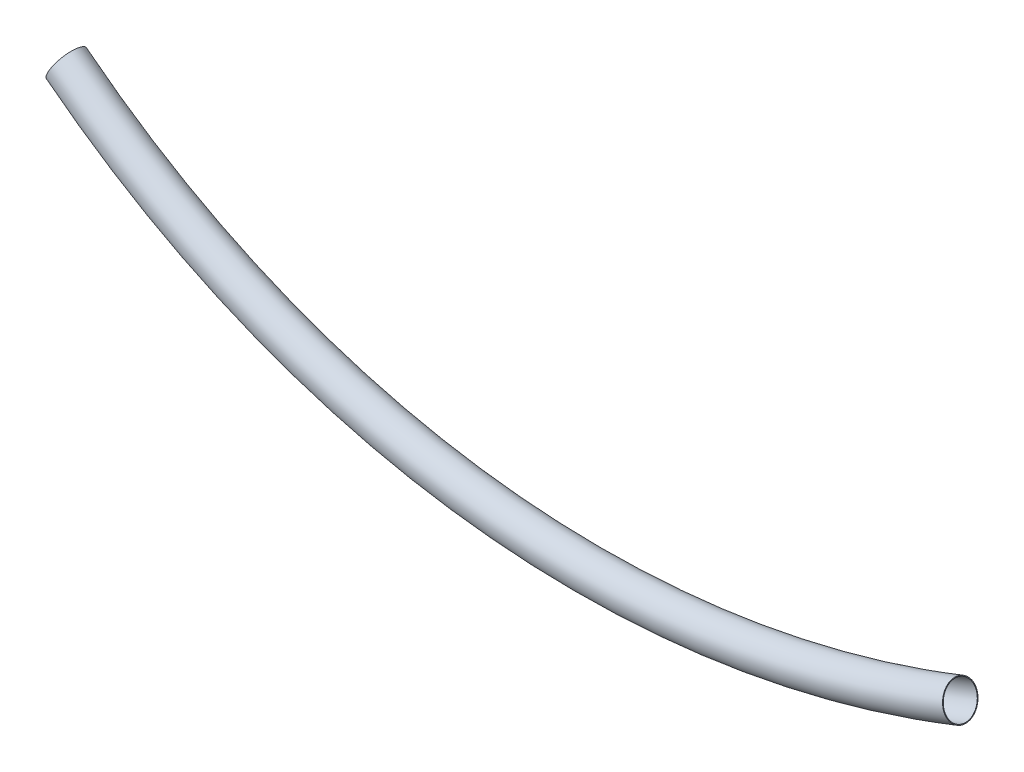
ISO-10303-21;
HEADER;
FILE_DESCRIPTION(('STEP AP214'),'2;1');
FILE_NAME('part.step','',(''),(''),'','','');
FILE_SCHEMA(('AUTOMOTIVE_DESIGN { 1 0 10303 214 1 1 1 1 }'));
ENDSEC;
DATA;
#1=APPLICATION_CONTEXT('core data for automotive mechanical design processes');
#2=APPLICATION_PROTOCOL_DEFINITION('international standard','automotive_design',2000,#1);
#3=PRODUCT_CONTEXT('',#1,'mechanical');
#4=PRODUCT('Part','Part','',(#3));
#5=PRODUCT_RELATED_PRODUCT_CATEGORY('part','',(#4));
#6=PRODUCT_DEFINITION_FORMATION('','',#4);
#7=PRODUCT_DEFINITION_CONTEXT('part definition',#1,'design');
#8=PRODUCT_DEFINITION('design','',#6,#7);
#9=PRODUCT_DEFINITION_SHAPE('','',#8);
#10=(LENGTH_UNIT() NAMED_UNIT(*) SI_UNIT(.MILLI.,.METRE.));
#11=(NAMED_UNIT(*) PLANE_ANGLE_UNIT() SI_UNIT($,.RADIAN.));
#12=(NAMED_UNIT(*) SI_UNIT($,.STERADIAN.) SOLID_ANGLE_UNIT());
#13=UNCERTAINTY_MEASURE_WITH_UNIT(LENGTH_MEASURE(1.E-05),#10,'distance_accuracy_value','');
#14=(GEOMETRIC_REPRESENTATION_CONTEXT(3) GLOBAL_UNCERTAINTY_ASSIGNED_CONTEXT((#13)) GLOBAL_UNIT_ASSIGNED_CONTEXT((#10,
#11,#12)) REPRESENTATION_CONTEXT('',''));
#15=CARTESIAN_POINT('',(0.,0.,0.));
#16=DIRECTION('',(0.,0.,1.));
#17=DIRECTION('',(1.,0.,0.));
#18=AXIS2_PLACEMENT_3D('',#15,#16,#17);
#19=CARTESIAN_POINT('',(5240.59258807553,-3970.66979282709,3800.09437515866));
#20=DIRECTION('',(-0.941114351142538,-0.331446569951202,0.0666854507455971));
#21=DIRECTION('',(0.332186000076311,-0.943213900106069,0.));
#22=AXIS2_PLACEMENT_3D('',#19,#20,#21);
#23=PLANE('',#22);
#24=CARTESIAN_POINT('',(5240.59258807553,-3970.66979282709,3800.09437515866));
#25=DIRECTION('',(-0.941114351142538,-0.331446569951202,0.0666854507455971));
#26=DIRECTION('',(0.332186000076311,-0.943213900106069,0.));
#27=AXIS2_PLACEMENT_3D('',#24,#25,#26);
#28=CIRCLE('',#27,80.7338999999999);
#29=CARTESIAN_POINT('',(5267.41125938709,-4046.81912951686,3800.09437515866));
#30=VERTEX_POINT('',#29);
#31=EDGE_CURVE('E55',#30,#30,#28,.T.);
#32=ORIENTED_EDGE('',*,*,#31,.T.);
#33=EDGE_LOOP('',(#32));
#34=FACE_BOUND('',#33,.T.);
#35=CARTESIAN_POINT('',(5240.59258807553,-3970.66979282709,3800.09437515866));
#36=DIRECTION('',(-0.941114351142538,-0.331446569951202,0.0666854507455971));
#37=DIRECTION('',(0.332186000076311,-0.943213900106069,0.));
#38=AXIS2_PLACEMENT_3D('',#35,#36,#37);
#39=CIRCLE('',#38,84.1375000000002);
#40=CARTESIAN_POINT('',(5268.54188765695,-4050.02945234726,3800.09437515866));
#41=VERTEX_POINT('',#40);
#42=EDGE_CURVE('E42',#41,#41,#39,.T.);
#43=ORIENTED_EDGE('',*,*,#42,.F.);
#44=EDGE_LOOP('',(#43));
#45=FACE_BOUND('',#44,.T.);
#46=ADVANCED_FACE('F39',(#34,#45),#23,.F.);
#47=CARTESIAN_POINT('',(3629.59201644663,474.860955787558,3160.07711591139));
#48=DIRECTION('',(0.0176715528555319,0.148748255784951,0.988717185357172));
#49=DIRECTION('',(0.,-0.98887160169456,0.148771487059972));
#50=AXIS2_PLACEMENT_3D('',#47,#48,#49);
#51=TOROIDAL_SURFACE('',#50,4771.54991284816,80.7338999999999);
#52=ORIENTED_EDGE('',*,*,#31,.F.);
#53=EDGE_LOOP('',(#52));
#54=FACE_BOUND('',#53,.T.);
#55=CARTESIAN_POINT('',(1004.01530185701,-3538.2294666105,3757.1026156186));
#56=CARTESIAN_POINT('',(1004.343077654,-3537.69711182915,3756.14950561159));
#57=CARTESIAN_POINT('',(1004.67934525389,-3537.1464417076,3755.20958507052));
#58=CARTESIAN_POINT('',(1005.36829896926,-3536.00940285016,3753.35764651678));
#59=CARTESIAN_POINT('',(1005.72098628294,-3535.42303150808,3752.44563054847));
#60=CARTESIAN_POINT('',(1006.44217972551,-3534.21559002067,3750.6510287914));
#61=CARTESIAN_POINT('',(1006.81068889177,-3533.59451320582,3749.76844871187));
#62=CARTESIAN_POINT('',(1007.56283139089,-3532.31883278213,3748.03437182661));
#63=CARTESIAN_POINT('',(1007.94646613166,-3531.66422605057,3747.1828779287));
#64=CARTESIAN_POINT('',(1008.72855068499,-3530.32201235509,3745.51166662036));
#65=CARTESIAN_POINT('',(1009.12701586778,-3529.63437092672,3744.69198408322));
#66=CARTESIAN_POINT('',(1009.93769319922,-3528.22791579532,3743.08672082576));
#67=CARTESIAN_POINT('',(1010.34990663814,-3527.50909916459,3742.30114332219));
#68=CARTESIAN_POINT('',(1011.18723313383,-3526.04177476453,3740.76567538105));
#69=CARTESIAN_POINT('',(1011.61234406366,-3525.29327188463,3740.01577911104));
#70=CARTESIAN_POINT('',(1012.47480627089,-3523.76774269408,3738.55277867976));
#71=CARTESIAN_POINT('',(1012.91215869113,-3522.99071371819,3737.83967797143));
#72=CARTESIAN_POINT('',(1013.79794493585,-3521.41019648336,3736.45211566227));
#73=CARTESIAN_POINT('',(1014.24637009471,-3520.60672876144,3735.77762513593));
#74=CARTESIAN_POINT('',(1015.15386203282,-3518.97413809305,3734.46781007152));
#75=CARTESIAN_POINT('',(1015.61292980184,-3518.14501275794,3733.83248919657));
#76=CARTESIAN_POINT('',(1016.54081282371,-3516.46272399888,3732.60223219029));
#77=CARTESIAN_POINT('',(1017.0096273156,-3515.60956244969,3732.00729292155));
#78=CARTESIAN_POINT('',(1017.95624545314,-3513.88058571572,3730.85872442713));
#79=CARTESIAN_POINT('',(1018.43404993261,-3513.00476842679,3730.30509905717));
#80=CARTESIAN_POINT('',(1019.39759831418,-3511.23240633174,3729.24035827553));
#81=CARTESIAN_POINT('',(1019.88333934552,-3510.33586897378,3728.729227883));
#82=CARTESIAN_POINT('',(1020.86206700741,-3508.52335707953,3727.75012556265));
#83=CARTESIAN_POINT('',(1021.35505430614,-3507.60738074731,3727.28215764409));
#84=CARTESIAN_POINT('',(1022.8434902138,-3504.83288188159,3725.94435615922));
#85=CARTESIAN_POINT('',(1023.84867214078,-3502.94731249595,3725.14033842159));
#86=CARTESIAN_POINT('',(1025.88079248616,-3499.11187983032,3723.7115531316));
#87=CARTESIAN_POINT('',(1026.90779417913,-3497.16181656027,3723.08741579423));
#88=CARTESIAN_POINT('',(1028.97305843265,-3493.21714404636,3722.02628636778));
#89=CARTESIAN_POINT('',(1030.01132102882,-3491.22253466156,3721.58929487091));
#90=CARTESIAN_POINT('',(1032.09176933977,-3487.20286786604,3720.90553396437));
#91=CARTESIAN_POINT('',(1033.13395526977,-3485.17780876617,3720.65877514756));
#92=CARTESIAN_POINT('',(1035.21483098099,-3481.11165692068,3720.35725226053));
#93=CARTESIAN_POINT('',(1036.25352075952,-3479.07056416269,3720.30248833855));
#94=CARTESIAN_POINT('',(1038.32236744442,-3474.98221114106,3720.38548332439));
#95=CARTESIAN_POINT('',(1039.35250000193,-3472.93494730891,3720.52367410158));
#96=CARTESIAN_POINT('',(1041.3945329175,-3468.85338791738,3720.99245364231));
#97=CARTESIAN_POINT('',(1042.40643323888,-3466.81909238409,3721.32304279292));
#98=CARTESIAN_POINT('',(1044.40477916747,-3462.77797361319,3722.17439275403));
#99=CARTESIAN_POINT('',(1045.39122478219,-3460.77115036747,3722.69515350841));
#100=CARTESIAN_POINT('',(1047.33159960363,-3456.79932141123,3723.92329504762));
#101=CARTESIAN_POINT('',(1048.28552886414,-3454.83431563152,3724.63067552372));
#102=CARTESIAN_POINT('',(1050.15291567033,-3450.96249762921,3726.22625085877));
#103=CARTESIAN_POINT('',(1051.06641961471,-3449.05561951585,3727.11423151343));
#104=CARTESIAN_POINT('',(1052.8475744441,-3445.31133641602,3729.06538784699));
#105=CARTESIAN_POINT('',(1053.71522533365,-3443.47393142266,3730.12856350853));
#106=CARTESIAN_POINT('',(1055.39838248128,-3439.88188245486,3732.42269886984));
#107=CARTESIAN_POINT('',(1056.21388953044,-3438.127237225,3733.65365602334));
#108=CARTESIAN_POINT('',(1057.78683953074,-3434.71340476927,3736.27474876812));
#109=CARTESIAN_POINT('',(1058.54428267978,-3433.05421721805,3737.66488381683));
#110=CARTESIAN_POINT('',(1059.99251856201,-3429.85013112161,3740.58838480294));
#111=CARTESIAN_POINT('',(1060.68357767375,-3428.30478215004,3742.12112514167));
#112=CARTESIAN_POINT('',(1061.99758620979,-3425.33195177431,3745.32395931452));
#113=CARTESIAN_POINT('',(1062.62053579051,-3423.90447009944,3746.99405283318));
#114=CARTESIAN_POINT('',(1063.79374508358,-3421.1778188491,3750.459740413));
#115=CARTESIAN_POINT('',(1064.34400634742,-3419.87864653506,3752.25533179422));
#116=CARTESIAN_POINT('',(1065.36779827708,-3417.41810196019,3755.95926711061));
#117=CARTESIAN_POINT('',(1065.84132922039,-3416.25672920103,3757.86761063801));
#118=CARTESIAN_POINT('',(1066.70582288995,-3414.08618068365,3761.77285687196));
#119=CARTESIAN_POINT('',(1067.09721608042,-3413.07621980508,3763.76922796007));
#120=CARTESIAN_POINT('',(1067.79775111316,-3411.20843395488,3767.84580964709));
#121=CARTESIAN_POINT('',(1068.10689324488,-3410.35060844791,3769.92601995094));
#122=CARTESIAN_POINT('',(1068.64064102983,-3408.79337643418,3774.15538768955));
#123=CARTESIAN_POINT('',(1068.86524851147,-3408.09396650118,3776.30454363199));
#124=CARTESIAN_POINT('',(1069.228276506,-3406.85865170874,3780.65645733212));
#125=CARTESIAN_POINT('',(1069.36669720227,-3406.32274650142,3782.85921497574));
#126=CARTESIAN_POINT('',(1069.555939312,-3405.42020486703,3787.29337970853));
#127=CARTESIAN_POINT('',(1069.60711871279,-3405.05288124009,3789.52463168107));
#128=CARTESIAN_POINT('',(1069.62261253403,-3404.48689881779,3794.00872003126));
#129=CARTESIAN_POINT('',(1069.58692722579,-3404.28823949563,3796.26155634147));
#130=CARTESIAN_POINT('',(1069.42895993203,-3404.06097621656,3800.77273867538));
#131=CARTESIAN_POINT('',(1069.30667881318,-3404.03237055773,3803.03108464371));
#132=CARTESIAN_POINT('',(1068.97642484174,-3404.14534812328,3807.53722808135));
#133=CARTESIAN_POINT('',(1068.76845196241,-3404.28693140078,3809.78502554736));
#134=CARTESIAN_POINT('',(1068.2685855031,-3404.73895940858,3814.25195004325));
#135=CARTESIAN_POINT('',(1067.97677236189,-3405.04924253682,3816.47110243364));
#136=CARTESIAN_POINT('',(1067.31128434192,-3405.83622580662,3820.86721581141));
#137=CARTESIAN_POINT('',(1066.93760956799,-3406.31292573509,3823.0441768528));
#138=CARTESIAN_POINT('',(1066.11112102568,-3407.4292075331,3827.34056159674));
#139=CARTESIAN_POINT('',(1065.65830685593,-3408.06879022875,3829.45998500741));
#140=CARTESIAN_POINT('',(1064.67682734938,-3409.50613561984,3833.62639143803));
#141=CARTESIAN_POINT('',(1064.14816182167,-3410.30389871341,3835.67337427563));
#142=CARTESIAN_POINT('',(1063.0173145599,-3412.05408404683,3839.68583659275));
#143=CARTESIAN_POINT('',(1062.41494350338,-3413.00690673846,3841.6510880402));
#144=CARTESIAN_POINT('',(1061.14213986632,-3415.05878390305,3845.48061007403));
#145=CARTESIAN_POINT('',(1060.47170720919,-3416.15783854054,3847.3448805468));
#146=CARTESIAN_POINT('',(1059.06758213115,-3418.49426034761,3850.95948719219));
#147=CARTESIAN_POINT('',(1058.33388859247,-3419.73162996121,3852.70982135071));
#148=CARTESIAN_POINT('',(1056.80848987191,-3422.33578835227,3856.08439066546));
#149=CARTESIAN_POINT('',(1056.01678448507,-3423.70257758695,3857.70862537616));
#150=CARTESIAN_POINT('',(1054.37690046026,-3426.56295349086,3860.82755386324));
#151=CARTESIAN_POINT('',(1053.5284598171,-3428.05713865319,3862.3215610352));
#152=CARTESIAN_POINT('',(1051.78471585659,-3431.15568924477,3865.16053211989));
#153=CARTESIAN_POINT('',(1050.88941239963,-3432.76005500226,3866.50549558858));
#154=CARTESIAN_POINT('',(1049.05827785139,-3436.06758462668,3869.03711284367));
#155=CARTESIAN_POINT('',(1048.12244586602,-3437.77075067352,3870.22376313519));
#156=CARTESIAN_POINT('',(1046.21688511984,-3441.26378912671,3872.43054638668));
#157=CARTESIAN_POINT('',(1045.24715625751,-3443.05366179274,3873.45067884789));
#158=CARTESIAN_POINT('',(1043.27561022729,-3446.71681729039,3875.32217406902));
#159=CARTESIAN_POINT('',(1042.27365464385,-3448.59047892358,3876.17264966795));
#160=CARTESIAN_POINT('',(1040.24949917661,-3452.39934917718,3877.69238962617));
#161=CARTESIAN_POINT('',(1039.2272992223,-3454.334558012,3878.36165335409));
#162=CARTESIAN_POINT('',(1037.16986960493,-3458.25285459106,3879.51432598915));
#163=CARTESIAN_POINT('',(1036.13463971388,-3460.23594317359,3879.9977316397));
#164=CARTESIAN_POINT('',(1034.05848190918,-3464.23595107653,3880.77529451697));
#165=CARTESIAN_POINT('',(1033.01755398889,-3466.25287043638,3881.0694515231));
#166=CARTESIAN_POINT('',(1030.93426323998,-3470.31231429425,3881.46702194633));
#167=CARTESIAN_POINT('',(1029.89190531227,-3472.35489699292,3881.5698670449));
#168=CARTESIAN_POINT('',(1027.81625899057,-3476.44525892123,3881.58230599899));
#169=CARTESIAN_POINT('',(1026.78297061895,-3478.49303816365,3881.49189937838));
#170=CARTESIAN_POINT('',(1024.73281543495,-3482.5792340784,3881.1183843366));
#171=CARTESIAN_POINT('',(1023.71594867949,-3484.61765071825,3880.83527524755));
#172=CARTESIAN_POINT('',(1021.70589506432,-3488.67058765506,3880.07823934376));
#173=CARTESIAN_POINT('',(1020.71270817648,-3490.6851079804,3879.60431275562));
#174=CARTESIAN_POINT('',(1018.75753013665,-3494.67502339178,3878.46909609363));
#175=CARTESIAN_POINT('',(1017.79552604819,-3496.65043456672,3877.80788485457));
#176=CARTESIAN_POINT('',(1015.9091778469,-3500.54885719916,3876.30254690501));
#177=CARTESIAN_POINT('',(1014.98483374893,-3502.47186863599,3875.45842012237));
#178=CARTESIAN_POINT('',(1013.18047368351,-3506.25164926153,3873.59308980642));
#179=CARTESIAN_POINT('',(1012.30045735465,-3508.10841899032,3872.57188771719));
#180=CARTESIAN_POINT('',(1010.59111652887,-3511.74232299817,3870.35950889052));
#181=CARTESIAN_POINT('',(1009.76179187833,-3513.51945751856,3869.16833266822));
#182=CARTESIAN_POINT('',(1008.16271405887,-3516.97504934508,3866.62887545379));
#183=CARTESIAN_POINT('',(1007.39275968841,-3518.65383483848,3865.28116773314));
#184=CARTESIAN_POINT('',(1005.91476117451,-3521.90739423178,3862.43470964068));
#185=CARTESIAN_POINT('',(1005.20671691848,-3523.48216832085,3860.93595954361));
#186=CARTESIAN_POINT('',(1003.85771717146,-3526.51623147107,3857.79800780646));
#187=CARTESIAN_POINT('',(1003.21676047366,-3527.97552260949,3856.15880869383));
#188=CARTESIAN_POINT('',(1002.0066225417,-3530.76799534405,3852.75156062112));
#189=CARTESIAN_POINT('',(1001.43744105259,-3532.10117738814,3850.98351211877));
#190=CARTESIAN_POINT('',(1000.37773912171,-3534.6252468598,3847.3404322612));
#191=CARTESIAN_POINT('',(999.886834668117,-3535.81682115333,3845.46598846709));
#192=CARTESIAN_POINT('',(998.983819474675,-3538.05679026865,3841.61533810337));
#193=CARTESIAN_POINT('',(998.571708497493,-3539.10518552172,3839.6391318403));
#194=CARTESIAN_POINT('',(997.829330268591,-3541.05109125025,3835.59913168007));
#195=CARTESIAN_POINT('',(997.499058074025,-3541.94861083714,3833.53534308147));
#196=CARTESIAN_POINT('',(996.922763013274,-3543.58626083897,3829.33493501255));
#197=CARTESIAN_POINT('',(996.676739850453,-3544.32639180806,3827.19831579869));
#198=CARTESIAN_POINT('',(996.271665766052,-3545.64094263382,3822.87698591157));
#199=CARTESIAN_POINT('',(996.112226416913,-3546.21609702035,3820.69253653366));
#200=CARTESIAN_POINT('',(995.937915610238,-3546.95463994712,3817.3852904291));
#201=CARTESIAN_POINT('',(995.890618033667,-3547.18014492444,3816.27762774635));
#202=CARTESIAN_POINT('',(995.817710511083,-3547.58939980612,3814.05393559295));
#203=CARTESIAN_POINT('',(995.792098534505,-3547.77315361874,3812.93790691555));
#204=CARTESIAN_POINT('',(995.762605840485,-3548.09862862752,3810.69908681091));
#205=CARTESIAN_POINT('',(995.75873247506,-3548.24033558804,3809.57629322429));
#206=CARTESIAN_POINT('',(995.772740160045,-3548.4813774871,3807.32640338716));
#207=CARTESIAN_POINT('',(995.790619167849,-3548.58071640293,3806.19930755054));
#208=CARTESIAN_POINT('',(995.848097707582,-3548.73687084879,3803.94264035716));
#209=CARTESIAN_POINT('',(995.887698919884,-3548.79368308826,3802.8130688156));
#210=CARTESIAN_POINT('',(995.988544784618,-3548.86467248028,3800.55365827417));
#211=CARTESIAN_POINT('',(996.049787403719,-3548.87885363706,3799.42381930939));
#212=CARTESIAN_POINT('',(996.19370741304,-3548.86458371594,3797.16729502983));
#213=CARTESIAN_POINT('',(996.276356023141,-3548.83618963635,3796.04060751821));
#214=CARTESIAN_POINT('',(996.462966181683,-3548.7369384792,3793.79098023662));
#215=CARTESIAN_POINT('',(996.566925733037,-3548.66608537936,3792.66804012548));
#216=CARTESIAN_POINT('',(996.795990055702,-3548.48204247801,3790.42761888815));
#217=CARTESIAN_POINT('',(996.92109818205,-3548.36884595562,3789.3101386571));
#218=CARTESIAN_POINT('',(997.192206360069,-3548.10034478311,3787.0829046986));
#219=CARTESIAN_POINT('',(997.338204462741,-3547.94504406002,3785.97315026047));
#220=CARTESIAN_POINT('',(997.650674506741,-3547.59280133165,3783.76436058799));
#221=CARTESIAN_POINT('',(997.817125346679,-3547.39590209572,3782.66531554771));
#222=CARTESIAN_POINT('',(998.170298817048,-3546.96075397459,3780.47883804794));
#223=CARTESIAN_POINT('',(998.357019579313,-3546.72250889879,3779.39140452841));
#224=CARTESIAN_POINT('',(998.7503711928,-3546.2051422951,3777.23015869461));
#225=CARTESIAN_POINT('',(998.956998372074,-3545.92602830099,3776.15634390942));
#226=CARTESIAN_POINT('',(999.389796405311,-3545.32743343179,3774.02411735557));
#227=CARTESIAN_POINT('',(999.615965878529,-3545.00795540786,3772.96570450487));
#228=CARTESIAN_POINT('',(1000.14271249759,-3544.2496467577,3770.61998610052));
#229=CARTESIAN_POINT('',(1000.44830690005,-3543.8003905685,3769.3371587962));
#230=CARTESIAN_POINT('',(1001.08776111237,-3542.84258726989,3766.80139828927));
#231=CARTESIAN_POINT('',(1001.42161459038,-3542.33405343288,3765.54845847017));
#232=CARTESIAN_POINT('',(1002.11673347684,-3541.25901718427,3763.07548917687));
#233=CARTESIAN_POINT('',(1002.47799880138,-3540.69251495007,3761.85545960196));
#234=CARTESIAN_POINT('',(1003.22704747436,-3539.50295230219,3759.45125712631));
#235=CARTESIAN_POINT('',(1003.6148367643,-3538.87987920603,3758.26709234576));
#236=CARTESIAN_POINT('',(1004.01530185701,-3538.2294666105,3757.1026156186));
#237=B_SPLINE_CURVE_WITH_KNOTS('',3,(#55,#56,#57,#58,#59,#60,#61,#62,#63,#64,#65,#66,#67,#68,
#69,#70,#71,#72,#73,#74,#75,#76,#77,#78,#79,#80,#81,#82,#83,#84,#85,#86,#87,#88,#89,#90,#91,#92,
#93,#94,#95,#96,#97,#98,#99,#100,#101,#102,#103,#104,#105,#106,#107,#108,#109,#110,#111,#112,
#113,#114,#115,#116,#117,#118,#119,#120,#121,#122,#123,#124,#125,#126,#127,#128,#129,#130,#131,
#132,#133,#134,#135,#136,#137,#138,#139,#140,#141,#142,#143,#144,#145,#146,#147,#148,#149,#150,
#151,#152,#153,#154,#155,#156,#157,#158,#159,#160,#161,#162,#163,#164,#165,#166,#167,#168,#169,
#170,#171,#172,#173,#174,#175,#176,#177,#178,#179,#180,#181,#182,#183,#184,#185,#186,#187,#188,
#189,#190,#191,#192,#193,#194,#195,#196,#197,#198,#199,#200,#201,#202,#203,#204,#205,#206,#207,
#208,#209,#210,#211,#212,#213,#214,#215,#216,#217,#218,#219,#220,#221,#222,#223,#224,#225,#226,
#227,#228,#229,#230,#231,#232,#233,#234,#235,#236),.UNSPECIFIED.,.T.,.F.,(4,2,2,2,2,2,2,2,2,2,2,
2,2,2,2,2,2,2,2,2,2,2,2,2,2,2,2,2,2,2,2,2,2,2,2,2,2,2,2,2,2,2,2,2,2,2,2,2,2,2,2,2,2,2,2,2,2,2,2,
2,2,2,2,2,2,2,2,2,2,2,2,2,2,2,2,2,2,2,2,2,2,2,2,2,2,2,2,2,2,2,4),(0.,3.41923778224955,
6.83872546813977,10.2588725683833,13.6793387771304,17.1034544567725,20.52789239814,
23.9517686461382,27.3759656121742,30.7975627714488,34.2194794336443,37.6411299290077,
41.0630993594769,44.4838572750885,47.9049326175428,54.7452475868239,61.6092442571655,
68.4732626480659,75.3376632253321,82.20206910238,89.0818634780681,95.9616716943908,
102.841477880378,109.721272684645,116.592954670905,123.46463597671,130.336213009448,
137.207766620523,144.050481577433,150.893180818357,157.735733981414,164.578262398944,
171.383982141004,178.189677934445,184.995226519431,191.800760624876,198.578300961801,
205.355820129621,212.133271467045,218.910724919634,225.681697479478,232.452661369491,
239.223659600738,245.994674873661,252.783462649747,259.572258064643,266.361173456342,
273.150112833514,279.972917445768,286.795742385232,293.618717918957,300.441713888626,
307.29950340094,314.157316806262,321.0152503684,327.87319192458,334.751473612027,
341.62977224633,348.508094720388,355.386409026548,362.261832296821,369.137258278438,
376.012628192172,382.887977269095,389.73889652659,396.58980332344,403.440586860841,
410.291346062877,417.107387791929,423.923408989694,430.739018417282,437.554603847102,
444.339355536952,447.732649966671,451.125626624837,454.519750721496,457.913556125511,
461.307624102697,464.701373272844,468.090583058866,471.479475380972,474.868905826729,
478.258020250579,481.643666980641,485.029001939216,488.413713628769,491.798186369767,
495.97570011161,500.15228028785,504.328847681799,508.506353733344),.UNSPECIFIED.);
#238=CARTESIAN_POINT('',(1004.01530185701,-3538.2294666105,3757.1026156186));
#239=VERTEX_POINT('',#238);
#240=EDGE_CURVE('E50',#239,#239,#237,.T.);
#241=ORIENTED_EDGE('',*,*,#240,.F.);
#242=EDGE_LOOP('',(#241));
#243=FACE_BOUND('',#242,.T.);
#244=ADVANCED_FACE('F64',(#54,#243),#51,.F.);
#245=CARTESIAN_POINT('',(1078.97021349365,-3393.82866209088,3728.94424576945));
#246=DIRECTION('',(0.890522591322084,-0.451729947381443,0.0539404206857884));
#247=DIRECTION('',(0.452388554649849,0.891820943699923,0.));
#248=AXIS2_PLACEMENT_3D('',#245,#246,#247);
#249=PLANE('',#248);
#250=ORIENTED_EDGE('',*,*,#240,.T.);
#251=EDGE_LOOP('',(#250));
#252=FACE_BOUND('',#251,.T.);
#253=CARTESIAN_POINT('',(1002.22512212127,-3541.77268146206,3756.98432285848));
#254=CARTESIAN_POINT('',(1002.55628713555,-3541.24025251259,3755.97588012385));
#255=CARTESIAN_POINT('',(1002.89647274793,-3540.68846151681,3754.98066253199));
#256=CARTESIAN_POINT('',(1003.59431295238,-3539.54709068643,3753.01829218516));
#257=CARTESIAN_POINT('',(1003.95196881896,-3538.95750809385,3752.05114148598));
#258=CARTESIAN_POINT('',(1004.68414110795,-3537.74155995181,3750.14652575326));
#259=CARTESIAN_POINT('',(1005.05866076662,-3537.11518733507,3749.20906647697));
#260=CARTESIAN_POINT('',(1005.82385455771,-3535.82684138646,3747.3655897509));
#261=CARTESIAN_POINT('',(1006.21453019416,-3535.16486473831,3746.45957524297));
#262=CARTESIAN_POINT('',(1007.01172091196,-3533.80584362666,3744.67972615549));
#263=CARTESIAN_POINT('',(1007.41825243804,-3533.1087625245,3743.80592691801));
#264=CARTESIAN_POINT('',(1008.24606685315,-3531.68138201328,3742.09298301294));
#265=CARTESIAN_POINT('',(1008.66735112699,-3530.95107948386,3741.25384161481));
#266=CARTESIAN_POINT('',(1009.52380457432,-3529.45876194928,3739.61190740735));
#267=CARTESIAN_POINT('',(1009.95897145934,-3528.69675216466,3738.80910865938));
#268=CARTESIAN_POINT('',(1010.84251442976,-3527.14221072165,3737.2410442979));
#269=CARTESIAN_POINT('',(1011.29089174873,-3526.34967621082,3736.47578220735));
#270=CARTESIAN_POINT('',(1012.19966535737,-3524.73619460998,3734.98477659011));
#271=CARTESIAN_POINT('',(1012.6600522238,-3523.91526964088,3734.25900338121));
#272=CARTESIAN_POINT('',(1013.59239302674,-3522.2458300654,3732.84754430705));
#273=CARTESIAN_POINT('',(1014.06434803935,-3521.39731288989,3732.16186219142));
#274=CARTESIAN_POINT('',(1015.01890551828,-3519.67434473023,3730.83190067677));
#275=CARTESIAN_POINT('',(1015.50150715315,-3518.79989576937,3730.18761805997));
#276=CARTESIAN_POINT('',(1016.47657671046,-3517.02648426557,3728.94145826478));
#277=CARTESIAN_POINT('',(1016.96904554832,-3516.12751944535,3728.33958504452));
#278=CARTESIAN_POINT('',(1017.96276742234,-3514.30705369819,3727.17954807529));
#279=CARTESIAN_POINT('',(1018.4640172894,-3513.38556085605,3726.62136893913));
#280=CARTESIAN_POINT('',(1019.47458413092,-3511.52136775096,3725.54943163485));
#281=CARTESIAN_POINT('',(1019.98390184953,-3510.5786655283,3725.03567759296));
#282=CARTESIAN_POINT('',(1021.52251561062,-3507.72140825329,3723.56254048986));
#283=CARTESIAN_POINT('',(1022.56273956082,-3505.77721289219,3722.67097051489));
#284=CARTESIAN_POINT('',(1024.66806846068,-3501.81769608234,3721.0727140271));
#285=CARTESIAN_POINT('',(1025.73324841809,-3499.80214732673,3720.3666927892));
#286=CARTESIAN_POINT('',(1027.87754578536,-3495.72043872539,3719.14839980004));
#287=CARTESIAN_POINT('',(1028.95666323957,-3493.65427871856,3718.63612866569));
#288=CARTESIAN_POINT('',(1031.12121217693,-3489.48594702746,3717.80892945797));
#289=CARTESIAN_POINT('',(1032.20664401225,-3487.38377332164,3717.49401250028));
#290=CARTESIAN_POINT('',(1034.37609820075,-3483.15837209515,3717.06376572633));
#291=CARTESIAN_POINT('',(1035.46012055259,-3481.03514455455,3716.9484360989));
#292=CARTESIAN_POINT('',(1037.62175576923,-3476.77739524243,3716.91817823536));
#293=CARTESIAN_POINT('',(1038.69934617405,-3474.64285852672,3717.00374595109));
#294=CARTESIAN_POINT('',(1040.83773718743,-3470.38289466468,3717.37578132831));
#295=CARTESIAN_POINT('',(1041.89853776002,-3468.25746753786,3717.66224942011));
#296=CARTESIAN_POINT('',(1043.9957853102,-3464.03086276676,3718.43416827597));
#297=CARTESIAN_POINT('',(1045.03223226668,-3461.92968514349,3718.9196192125));
#298=CARTESIAN_POINT('',(1047.0733598837,-3457.76658665926,3720.08620270784));
#299=CARTESIAN_POINT('',(1048.07804059142,-3455.70466573997,3720.7673349759));
#300=CARTESIAN_POINT('',(1050.04752314026,-3451.63671653649,3722.3198956645));
#301=CARTESIAN_POINT('',(1051.01236072298,-3449.63063870861,3723.19114892252));
#302=CARTESIAN_POINT('',(1052.89619346006,-3445.68680608937,3725.1183065088));
#303=CARTESIAN_POINT('',(1053.81518861089,-3443.74905130327,3726.17421085124));
#304=CARTESIAN_POINT('',(1055.60068057864,-3439.95586336694,3728.46332264183));
#305=CARTESIAN_POINT('',(1056.46717814005,-3438.10042904939,3729.69652757476));
#306=CARTESIAN_POINT('',(1058.14139156882,-3434.48529683406,3732.33163131674));
#307=CARTESIAN_POINT('',(1058.9491076317,-3432.72559861785,3733.73352956465));
#308=CARTESIAN_POINT('',(1060.49673645539,-3429.32161349078,3736.69019155995));
#309=CARTESIAN_POINT('',(1061.23690896884,-3427.67689067352,3738.24431749995));
#310=CARTESIAN_POINT('',(1062.64769911158,-3424.50705291459,3741.49920776765));
#311=CARTESIAN_POINT('',(1063.31831689084,-3422.98193771503,3743.19997177917));
#312=CARTESIAN_POINT('',(1064.58507070599,-3420.06246762517,3746.73608027845));
#313=CARTESIAN_POINT('',(1065.1812083073,-3418.66810998675,3748.57142193635));
#314=CARTESIAN_POINT('',(1066.2946264107,-3416.02033505269,3752.36366631219));
#315=CARTESIAN_POINT('',(1066.81190720199,-3414.76691724018,3754.32056858428));
#316=CARTESIAN_POINT('',(1067.76122254916,-3412.41658061273,3758.33111717384));
#317=CARTESIAN_POINT('',(1068.19370079596,-3411.31885604341,3760.38418630998));
#318=CARTESIAN_POINT('',(1068.9736824975,-3409.27995826461,3764.58214875482));
#319=CARTESIAN_POINT('',(1069.32118624829,-3408.3387845097,3766.72704174356));
#320=CARTESIAN_POINT('',(1069.92864986483,-3406.61988616132,3771.09329961715));
#321=CARTESIAN_POINT('',(1070.1886116682,-3405.84215795039,3773.31466280824));
#322=CARTESIAN_POINT('',(1070.61907996831,-3404.45581258818,3777.81800127571));
#323=CARTESIAN_POINT('',(1070.78958666956,-3403.84719505031,3780.0999764135));
#324=CARTESIAN_POINT('',(1071.03934710703,-3402.80575183032,3784.69826793266));
#325=CARTESIAN_POINT('',(1071.11898915966,-3402.37218324169,3787.01439500489));
#326=CARTESIAN_POINT('',(1071.18775254752,-3401.68022966665,3791.67399532876));
#327=CARTESIAN_POINT('',(1071.17687417361,-3401.42184411734,3794.01746849252));
#328=CARTESIAN_POINT('',(1071.06468242358,-3401.0820855336,3798.71502946623));
#329=CARTESIAN_POINT('',(1070.96337004737,-3401.00071054202,3801.06911715853));
#330=CARTESIAN_POINT('',(1070.67106228086,-3401.01549061842,3805.77115810185));
#331=CARTESIAN_POINT('',(1070.48006687902,-3401.11164570924,3808.11911135209));
#332=CARTESIAN_POINT('',(1070.01008979631,-3401.48047810693,3812.78931167223));
#333=CARTESIAN_POINT('',(1069.73121600192,-3401.75293939613,3815.11158666744));
#334=CARTESIAN_POINT('',(1069.0874549705,-3402.47211134072,3819.71689441345));
#335=CARTESIAN_POINT('',(1068.72256785812,-3402.91882174357,3821.99992722111));
#336=CARTESIAN_POINT('',(1067.90944248088,-3403.98316729731,3826.51064022498));
#337=CARTESIAN_POINT('',(1067.46120388307,-3404.60080313097,3828.73832020004));
#338=CARTESIAN_POINT('',(1066.48463410278,-3406.00244786186,3833.12264920257));
#339=CARTESIAN_POINT('',(1065.95630272862,-3406.78645715725,3835.27929806004));
#340=CARTESIAN_POINT('',(1064.82201219696,-3408.51718986407,3839.51151475536));
#341=CARTESIAN_POINT('',(1064.21587031538,-3409.46429813173,3841.5868762331));
#342=CARTESIAN_POINT('',(1062.93133164023,-3411.51302687465,3845.63650320349));
#343=CARTESIAN_POINT('',(1062.25293477739,-3412.61464749808,3847.6107685992));
#344=CARTESIAN_POINT('',(1060.82875055374,-3414.96445094875,3851.4444731496));
#345=CARTESIAN_POINT('',(1060.08296204594,-3416.21263627061,3853.30391034901));
#346=CARTESIAN_POINT('',(1058.5293343036,-3418.84658667217,3856.89502670102));
#347=CARTESIAN_POINT('',(1057.72149485091,-3420.23235223556,3858.62670540443));
#348=CARTESIAN_POINT('',(1056.04541330615,-3423.138670308,3861.95848458372));
#349=CARTESIAN_POINT('',(1055.17689500028,-3424.65984916285,3863.55789977559));
#350=CARTESIAN_POINT('',(1053.3891963395,-3427.82025233649,3866.60454424889));
#351=CARTESIAN_POINT('',(1052.47001583824,-3429.45947699629,3868.05177309065));
#352=CARTESIAN_POINT('',(1050.58750058027,-3432.84433346773,3870.78407158075));
#353=CARTESIAN_POINT('',(1049.62416484868,-3434.58996762899,3872.06913764645));
#354=CARTESIAN_POINT('',(1047.66016762078,-3438.17524297336,3874.4682227191));
#355=CARTESIAN_POINT('',(1046.65950600934,-3440.01488444643,3875.58224119842));
#356=CARTESIAN_POINT('',(1044.62264051498,-3443.78493919441,3877.63688044426));
#357=CARTESIAN_POINT('',(1043.58627946152,-3445.71577305385,3878.57657376712));
#358=CARTESIAN_POINT('',(1041.49031103032,-3449.64560661962,3880.268880346));
#359=CARTESIAN_POINT('',(1040.43070357116,-3451.64460656474,3881.02149294656));
#360=CARTESIAN_POINT('',(1038.29571954981,-3455.69665466594,3882.33442352224));
#361=CARTESIAN_POINT('',(1037.2203427013,-3457.7497038039,3882.89473800139));
#362=CARTESIAN_POINT('',(1035.06143383993,-3461.89530894585,3883.81914905327));
#363=CARTESIAN_POINT('',(1033.97790181627,-3463.98786500212,3884.18324536632));
#364=CARTESIAN_POINT('',(1031.80688517413,-3468.20440494476,3884.71349706213));
#365=CARTESIAN_POINT('',(1030.71939892991,-3470.3284675268,3884.87902023934));
#366=CARTESIAN_POINT('',(1028.55163932894,-3474.58640597146,3885.00880394452));
#367=CARTESIAN_POINT('',(1027.47136599081,-3476.72028185939,3884.97306395319));
#368=CARTESIAN_POINT('',(1025.32571212603,-3480.98268686196,3884.70049010967));
#369=CARTESIAN_POINT('',(1024.26033166624,-3483.11121595257,3884.46365535493));
#370=CARTESIAN_POINT('',(1022.15206219972,-3487.34776159952,3883.79045048959));
#371=CARTESIAN_POINT('',(1021.10917316991,-3489.45577817691,3883.3540805838));
#372=CARTESIAN_POINT('',(1019.05351452965,-3493.63589839541,3882.28484481562));
#373=CARTESIAN_POINT('',(1018.04073978756,-3495.70800812982,3881.65201264414));
#374=CARTESIAN_POINT('',(1016.05238279136,-3499.80185766715,3880.19415209457));
#375=CARTESIAN_POINT('',(1015.07680055794,-3501.823597442,3879.36912360943));
#376=CARTESIAN_POINT('',(1013.16985868186,-3505.80216820641,3877.5325650544));
#377=CARTESIAN_POINT('',(1012.2384987209,-3507.75899966311,3876.52103632712));
#378=CARTESIAN_POINT('',(1010.42673008439,-3511.59365048371,3874.3185004396));
#379=CARTESIAN_POINT('',(1009.54632125926,-3513.47147007954,3873.12749380624));
#380=CARTESIAN_POINT('',(1007.84572316891,-3517.12831706675,3870.57863940069));
#381=CARTESIAN_POINT('',(1007.02534095321,-3518.90765607639,3869.22136743916));
#382=CARTESIAN_POINT('',(1005.44748797705,-3522.36147812781,3866.3463225186));
#383=CARTESIAN_POINT('',(1004.690017111,-3524.03596134561,3864.82854982901));
#384=CARTESIAN_POINT('',(1003.24352210411,-3527.26788059146,3861.64321632939));
#385=CARTESIAN_POINT('',(1002.5544967631,-3528.82531867172,3859.97565814676));
#386=CARTESIAN_POINT('',(1001.24992767314,-3531.81181413164,3856.50254488537));
#387=CARTESIAN_POINT('',(1000.63438366217,-3533.24087196905,3854.6969902987));
#388=CARTESIAN_POINT('',(999.484206681165,-3535.95330322254,3850.97014057717));
#389=CARTESIAN_POINT('',(998.949182652776,-3537.23737265909,3849.04947267159));
#390=CARTESIAN_POINT('',(997.960280082039,-3539.65870997091,3845.09788138081));
#391=CARTESIAN_POINT('',(997.50640130003,-3540.79597827975,3843.06695832127));
#392=CARTESIAN_POINT('',(996.683147411112,-3542.91535441762,3838.90941779944));
#393=CARTESIAN_POINT('',(996.313767183762,-3543.89747164736,3836.78280614505));
#394=CARTESIAN_POINT('',(995.662202649557,-3545.69942285108,3832.4490916124));
#395=CARTESIAN_POINT('',(995.380018025647,-3546.51925741512,3830.24198902685));
#396=CARTESIAN_POINT('',(994.906013391981,-3547.98731355907,3825.77311231212));
#397=CARTESIAN_POINT('',(994.713780354949,-3548.63631341884,3823.51163921489));
#398=CARTESIAN_POINT('',(994.492839251937,-3549.48115975389,3820.08398061413));
#399=CARTESIAN_POINT('',(994.430423075474,-3549.74135946674,3818.93536170089));
#400=CARTESIAN_POINT('',(994.328157119581,-3550.21845741916,3816.6281997004));
#401=CARTESIAN_POINT('',(994.288305226392,-3550.43535971348,3815.46965755304));
#402=CARTESIAN_POINT('',(994.231232994521,-3550.8255354353,3813.1443151684));
#403=CARTESIAN_POINT('',(994.214020299311,-3550.99879411182,3811.97751227573));
#404=CARTESIAN_POINT('',(994.20228019355,-3551.30127148864,3809.63820422983));
#405=CARTESIAN_POINT('',(994.207750651637,-3551.43049432541,3808.46569962269));
#406=CARTESIAN_POINT('',(994.241363561822,-3551.64469910114,3806.11689020778));
#407=CARTESIAN_POINT('',(994.269507766551,-3551.72967761928,3804.94058511324));
#408=CARTESIAN_POINT('',(994.34841417299,-3551.85522548999,3802.58647535752));
#409=CARTESIAN_POINT('',(994.399174247799,-3551.89579901737,3801.40867084774));
#410=CARTESIAN_POINT('',(994.523121291962,-3551.93245628003,3799.0553924589));
#411=CARTESIAN_POINT('',(994.596273166728,-3551.92860929138,3797.87991780948));
#412=CARTESIAN_POINT('',(994.764887890542,-3551.87661067312,3795.53166234379));
#413=CARTESIAN_POINT('',(994.860348647246,-3551.8284631972,3794.35888128529));
#414=CARTESIAN_POINT('',(995.073426546994,-3551.68795478809,3792.01780152406));
#415=CARTESIAN_POINT('',(995.191047205499,-3551.59558683613,3790.84950356258));
#416=CARTESIAN_POINT('',(995.448207368088,-3551.36682255697,3788.51976165501));
#417=CARTESIAN_POINT('',(995.587744826558,-3551.23043033753,3787.35831707975));
#418=CARTESIAN_POINT('',(995.888337108585,-3550.91403450059,3785.04541811521));
#419=CARTESIAN_POINT('',(996.049369740338,-3550.73407570775,3783.89395470975));
#420=CARTESIAN_POINT('',(996.392752270135,-3550.33082900145,3781.60195762744));
#421=CARTESIAN_POINT('',(996.575100202438,-3550.10754508227,3780.4614229532));
#422=CARTESIAN_POINT('',(996.960759256491,-3549.61809427783,3778.19339255059));
#423=CARTESIAN_POINT('',(997.164066508999,-3549.35193530252,3777.06589445816));
#424=CARTESIAN_POINT('',(997.591282495115,-3548.77722371531,3774.82581085437));
#425=CARTESIAN_POINT('',(997.815189771865,-3548.46867410056,3773.71322429482));
#426=CARTESIAN_POINT('',(998.338018644268,-3547.73256818314,3771.24624622463));
#427=CARTESIAN_POINT('',(998.642230057074,-3547.29406204573,3769.89622373061));
#428=CARTESIAN_POINT('',(999.280527901087,-3546.35463533065,3767.22565743389));
#429=CARTESIAN_POINT('',(999.614607637705,-3545.85372872937,3765.90510710791));
#430=CARTESIAN_POINT('',(1000.31178608811,-3544.79080848257,3763.29666892136));
#431=CARTESIAN_POINT('',(1000.6748847119,-3544.22879502659,3762.0087809595));
#432=CARTESIAN_POINT('',(1001.42920168885,-3543.04506205097,3759.46878085453));
#433=CARTESIAN_POINT('',(1001.82042634389,-3542.42332914014,3758.21667681749));
#434=CARTESIAN_POINT('',(1002.22512212127,-3541.77268146206,3756.98432285848));
#435=B_SPLINE_CURVE_WITH_KNOTS('',3,(#253,#254,#255,#256,#257,#258,#259,#260,#261,#262,#263,
#264,#265,#266,#267,#268,#269,#270,#271,#272,#273,#274,#275,#276,#277,#278,#279,#280,#281,#282,
#283,#284,#285,#286,#287,#288,#289,#290,#291,#292,#293,#294,#295,#296,#297,#298,#299,#300,#301,
#302,#303,#304,#305,#306,#307,#308,#309,#310,#311,#312,#313,#314,#315,#316,#317,#318,#319,#320,
#321,#322,#323,#324,#325,#326,#327,#328,#329,#330,#331,#332,#333,#334,#335,#336,#337,#338,#339,
#340,#341,#342,#343,#344,#345,#346,#347,#348,#349,#350,#351,#352,#353,#354,#355,#356,#357,#358,
#359,#360,#361,#362,#363,#364,#365,#366,#367,#368,#369,#370,#371,#372,#373,#374,#375,#376,#377,
#378,#379,#380,#381,#382,#383,#384,#385,#386,#387,#388,#389,#390,#391,#392,#393,#394,#395,#396,
#397,#398,#399,#400,#401,#402,#403,#404,#405,#406,#407,#408,#409,#410,#411,#412,#413,#414,#415,
#416,#417,#418,#419,#420,#421,#422,#423,#424,#425,#426,#427,#428,#429,#430,#431,#432,#433,#434),
.UNSPECIFIED.,.T.,.F.,(4,2,2,2,2,2,2,2,2,2,2,2,2,2,2,2,2,2,2,2,2,2,2,2,2,2,2,2,2,2,2,2,2,2,2,2,
2,2,2,2,2,2,2,2,2,2,2,2,2,2,2,2,2,2,2,2,2,2,2,2,2,2,2,2,2,2,2,2,2,2,2,2,2,2,2,2,2,2,2,2,2,2,2,2,
2,2,2,2,2,2,4),(0.,3.56211423110598,7.12448871830094,10.6875497838279,14.250943302404,
17.8181363088817,21.3856650621141,24.9526087357145,28.5198865433374,32.0844448393122,
35.649335990034,39.2139497232155,42.7788957077326,46.3425805693683,49.9065960730341,
57.0327155617137,64.1840471515968,71.3354015110529,78.4871586237813,85.6389225030585,
92.8083603776989,99.9778136092728,107.147273055143,114.316721848024,121.479592955803,
128.642464613567,135.805234667281,142.96798089556,150.101905268023,157.23581425844,
164.369573282305,171.503306142575,178.598656068027,185.693981272465,192.789149422624,
199.884301352778,206.949016723854,214.01370939457,221.078323953285,228.142939421276,
235.198915377398,242.254881107742,249.310875024097,256.366885827016,263.439780373867,
270.512681703683,277.585703436892,284.658750037315,291.766405666675,298.874081829388,
305.981914993042,313.089770081584,320.234418943361,327.379092836868,334.523896613058,
341.668709844296,348.836210454217,356.00372955822,363.171280831792,370.338824748502,
377.505140196146,384.671459634814,391.837727485295,399.00397429835,406.146069634452,
413.28815298108,420.430111072796,427.572043697831,434.678085889424,441.784107093148,
448.889697572265,455.995262214305,463.06787235862,466.605135226627,470.142066678932,
473.680191967826,477.217984813738,480.756051149358,484.293784818883,487.826001957294,
491.35788794302,494.890334702216,498.422451954936,501.950950423285,505.479123742324,
509.006646897295,512.533920773304,516.88696340495,521.239032794213,525.591088685935,
529.944122749627),.UNSPECIFIED.);
#436=CARTESIAN_POINT('',(1002.22512212127,-3541.77268146206,3756.98432285848));
#437=VERTEX_POINT('',#436);
#438=EDGE_CURVE('E12',#437,#437,#435,.T.);
#439=ORIENTED_EDGE('',*,*,#438,.F.);
#440=EDGE_LOOP('',(#439));
#441=FACE_BOUND('',#440,.T.);
#442=ADVANCED_FACE('F61',(#252,#441),#249,.F.);
#443=CARTESIAN_POINT('',(3629.59201644663,474.860955787558,3160.07711591139));
#444=DIRECTION('',(0.0176715528555319,0.148748255784951,0.988717185357172));
#445=DIRECTION('',(0.,-0.98887160169456,0.148771487059972));
#446=AXIS2_PLACEMENT_3D('',#443,#444,#445);
#447=TOROIDAL_SURFACE('',#446,4771.54991284816,84.1375000000002);
#448=ORIENTED_EDGE('',*,*,#42,.T.);
#449=EDGE_LOOP('',(#448));
#450=FACE_BOUND('',#449,.T.);
#451=ORIENTED_EDGE('',*,*,#438,.T.);
#452=EDGE_LOOP('',(#451));
#453=FACE_BOUND('',#452,.T.);
#454=ADVANCED_FACE('F59',(#450,#453),#447,.T.);
#455=CLOSED_SHELL('',(#46,#244,#442,#454));
#456=MANIFOLD_SOLID_BREP('B2',#455);
#457=ADVANCED_BREP_SHAPE_REPRESENTATION('',(#18,#456),#14);
#458=SHAPE_DEFINITION_REPRESENTATION(#9,#457);
ENDSEC;
END-ISO-10303-21;
